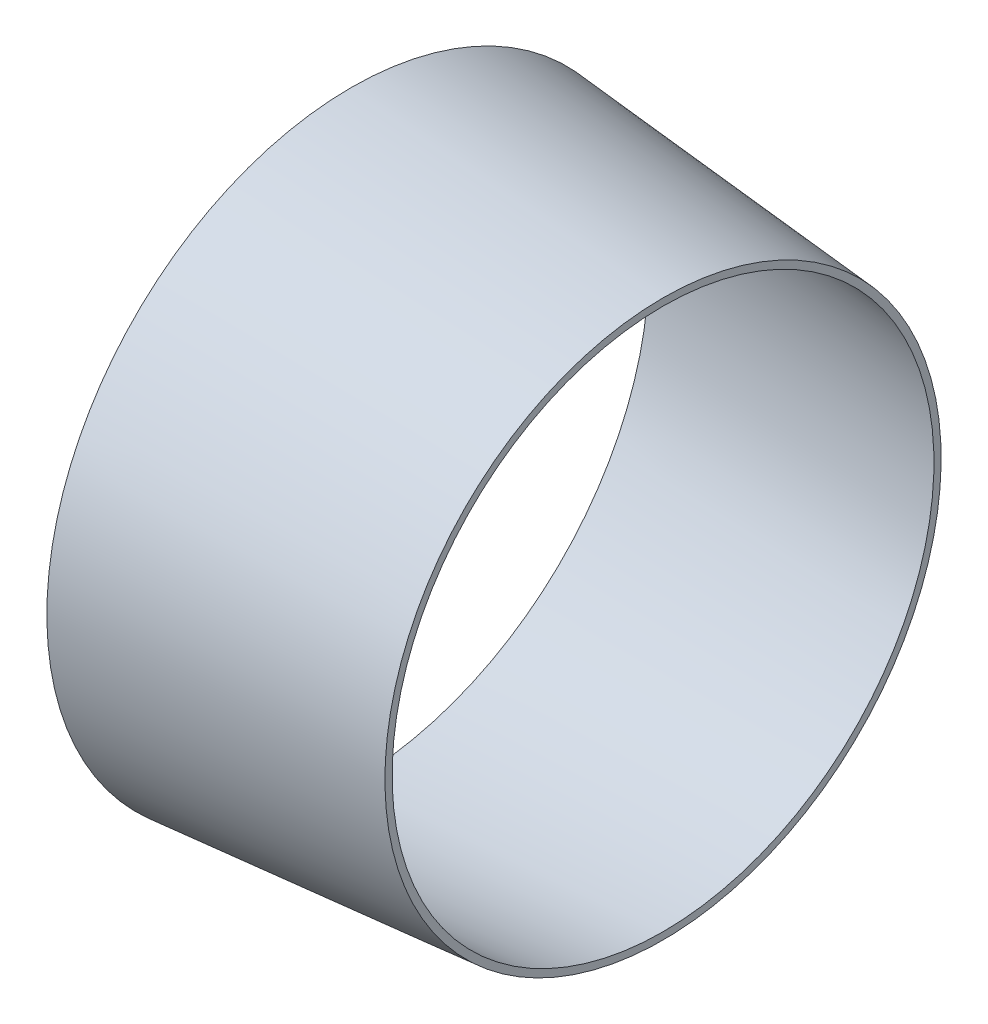
ISO-10303-21;
HEADER;
FILE_DESCRIPTION(('STEP AP214'),'2;1');
FILE_NAME('part.step','',(''),(''),'','','');
FILE_SCHEMA(('AUTOMOTIVE_DESIGN { 1 0 10303 214 1 1 1 1 }'));
ENDSEC;
DATA;
#1=APPLICATION_CONTEXT('core data for automotive mechanical design processes');
#2=APPLICATION_PROTOCOL_DEFINITION('international standard','automotive_design',2000,#1);
#3=PRODUCT_CONTEXT('',#1,'mechanical');
#4=PRODUCT('Part','Part','',(#3));
#5=PRODUCT_RELATED_PRODUCT_CATEGORY('part','',(#4));
#6=PRODUCT_DEFINITION_FORMATION('','',#4);
#7=PRODUCT_DEFINITION_CONTEXT('part definition',#1,'design');
#8=PRODUCT_DEFINITION('design','',#6,#7);
#9=PRODUCT_DEFINITION_SHAPE('','',#8);
#10=(LENGTH_UNIT() NAMED_UNIT(*) SI_UNIT(.MILLI.,.METRE.));
#11=(NAMED_UNIT(*) PLANE_ANGLE_UNIT() SI_UNIT($,.RADIAN.));
#12=(NAMED_UNIT(*) SI_UNIT($,.STERADIAN.) SOLID_ANGLE_UNIT());
#13=UNCERTAINTY_MEASURE_WITH_UNIT(LENGTH_MEASURE(1.E-05),#10,'distance_accuracy_value','');
#14=(GEOMETRIC_REPRESENTATION_CONTEXT(3) GLOBAL_UNCERTAINTY_ASSIGNED_CONTEXT((#13)) GLOBAL_UNIT_ASSIGNED_CONTEXT((#10,
#11,#12)) REPRESENTATION_CONTEXT('',''));
#15=CARTESIAN_POINT('',(0.,0.,0.));
#16=DIRECTION('',(0.,0.,1.));
#17=DIRECTION('',(1.,0.,0.));
#18=AXIS2_PLACEMENT_3D('',#15,#16,#17);
#19=CARTESIAN_POINT('',(3700.,0.,0.));
#20=DIRECTION('',(-1.,0.,0.));
#21=DIRECTION('',(0.,0.,1.));
#22=AXIS2_PLACEMENT_3D('',#19,#20,#21);
#23=CONICAL_SURFACE('',#22,620.,0.0844143056755337);
#24=CARTESIAN_POINT('',(3700.,0.,0.));
#25=DIRECTION('',(-1.,0.,0.));
#26=DIRECTION('',(0.,0.,1.));
#27=AXIS2_PLACEMENT_3D('',#24,#25,#26);
#28=CIRCLE('',#27,620.);
#29=CARTESIAN_POINT('',(3700.,620.,-4.4513433570036E-06));
#30=VERTEX_POINT('',#29);
#31=CARTESIAN_POINT('',(3700.,620.,0.));
#32=VERTEX_POINT('',#31);
#33=EDGE_CURVE('E11',#30,#32,#28,.T.);
#34=ORIENTED_EDGE('',*,*,#33,.T.);
#35=DIRECTION('',(0.996439227690749,-0.0843140884969096,0.));
#36=VECTOR('',#35,1.);
#37=CARTESIAN_POINT('',(4350.,565.,0.));
#38=LINE('',#37,#36);
#39=CARTESIAN_POINT('',(4350.,565.,0.));
#40=VERTEX_POINT('',#39);
#41=EDGE_CURVE('E100',#32,#40,#38,.T.);
#42=ORIENTED_EDGE('',*,*,#41,.T.);
#43=CARTESIAN_POINT('',(4350.,0.,0.));
#44=DIRECTION('',(-1.,0.,0.));
#45=DIRECTION('',(0.,0.,1.));
#46=AXIS2_PLACEMENT_3D('',#43,#44,#45);
#47=CIRCLE('',#46,565.);
#48=CARTESIAN_POINT('',(4350.,565.,-4.05646612372102E-06));
#49=VERTEX_POINT('',#48);
#50=EDGE_CURVE('E80',#49,#40,#47,.T.);
#51=ORIENTED_EDGE('',*,*,#50,.F.);
#52=DIRECTION('',(0.996439227690749,-0.0843140884969096,6.0534025440731E-10));
#53=VECTOR('',#52,1.);
#54=CARTESIAN_POINT('',(4350.,565.,-4.05646612372102E-06));
#55=LINE('',#54,#53);
#56=EDGE_CURVE('E103',#30,#49,#55,.T.);
#57=ORIENTED_EDGE('',*,*,#56,.F.);
#58=EDGE_LOOP('',(#34,#42,#51,#57));
#59=FACE_BOUND('',#58,.T.);
#60=ADVANCED_FACE('F39',(#59),#23,.F.);
#61=CARTESIAN_POINT('',(3700.,620.,-4.4513433570036E-06));
#62=DIRECTION('',(1.,0.,0.));
#63=DIRECTION('',(0.,0.,-1.));
#64=AXIS2_PLACEMENT_3D('',#61,#62,#63);
#65=PLANE('',#64);
#66=CARTESIAN_POINT('',(3700.,0.,0.));
#67=DIRECTION('',(-1.,0.,0.));
#68=DIRECTION('',(0.,0.,1.));
#69=AXIS2_PLACEMENT_3D('',#66,#67,#68);
#70=CIRCLE('',#69,635.);
#71=CARTESIAN_POINT('',(3700.,635.,-4.55903714789885E-06));
#72=VERTEX_POINT('',#71);
#73=CARTESIAN_POINT('',(3700.,635.,0.));
#74=VERTEX_POINT('',#73);
#75=EDGE_CURVE('E50',#72,#74,#70,.T.);
#76=ORIENTED_EDGE('',*,*,#75,.T.);
#77=DIRECTION('',(0.,-1.,0.));
#78=VECTOR('',#77,1.);
#79=CARTESIAN_POINT('',(3700.,620.,0.));
#80=LINE('',#79,#78);
#81=EDGE_CURVE('E104',#74,#32,#80,.T.);
#82=ORIENTED_EDGE('',*,*,#81,.T.);
#83=ORIENTED_EDGE('',*,*,#33,.F.);
#84=DIRECTION('',(0.,-1.,7.17958605968322E-09));
#85=VECTOR('',#84,1.);
#86=CARTESIAN_POINT('',(3700.,620.,-4.4513433570036E-06));
#87=LINE('',#86,#85);
#88=EDGE_CURVE('E91',#72,#30,#87,.T.);
#89=ORIENTED_EDGE('',*,*,#88,.F.);
#90=EDGE_LOOP('',(#76,#82,#83,#89));
#91=FACE_BOUND('',#90,.T.);
#92=ADVANCED_FACE('F41',(#91),#65,.F.);
#93=CARTESIAN_POINT('',(4350.,0.,0.));
#94=DIRECTION('',(-1.,0.,0.));
#95=DIRECTION('',(0.,0.,1.));
#96=AXIS2_PLACEMENT_3D('',#93,#94,#95);
#97=CONICAL_SURFACE('',#96,580.,0.0844143056755337);
#98=CARTESIAN_POINT('',(4350.,0.,0.));
#99=DIRECTION('',(-1.,0.,0.));
#100=DIRECTION('',(0.,0.,1.));
#101=AXIS2_PLACEMENT_3D('',#98,#99,#100);
#102=CIRCLE('',#101,580.);
#103=CARTESIAN_POINT('',(4350.,580.,-4.16415991461627E-06));
#104=VERTEX_POINT('',#103);
#105=CARTESIAN_POINT('',(4350.,580.,0.));
#106=VERTEX_POINT('',#105);
#107=EDGE_CURVE('E89',#104,#106,#102,.T.);
#108=ORIENTED_EDGE('',*,*,#107,.T.);
#109=DIRECTION('',(-0.996439227690749,0.0843140884969096,0.));
#110=VECTOR('',#109,1.);
#111=CARTESIAN_POINT('',(3700.,635.,0.));
#112=LINE('',#111,#110);
#113=EDGE_CURVE('E97',#106,#74,#112,.T.);
#114=ORIENTED_EDGE('',*,*,#113,.T.);
#115=ORIENTED_EDGE('',*,*,#75,.F.);
#116=DIRECTION('',(-0.996439227690749,0.0843140884969096,-6.0534025440731E-10));
#117=VECTOR('',#116,1.);
#118=CARTESIAN_POINT('',(3700.,635.,-4.55903714789885E-06));
#119=LINE('',#118,#117);
#120=EDGE_CURVE('E109',#104,#72,#119,.T.);
#121=ORIENTED_EDGE('',*,*,#120,.F.);
#122=EDGE_LOOP('',(#108,#114,#115,#121));
#123=FACE_BOUND('',#122,.T.);
#124=ADVANCED_FACE('F112',(#123),#97,.T.);
#125=CARTESIAN_POINT('',(4350.,580.,-4.16415991461627E-06));
#126=DIRECTION('',(-1.,0.,0.));
#127=DIRECTION('',(0.,0.,1.));
#128=AXIS2_PLACEMENT_3D('',#125,#126,#127);
#129=PLANE('',#128);
#130=DIRECTION('',(0.,1.,-7.17958605968322E-09));
#131=VECTOR('',#130,1.);
#132=CARTESIAN_POINT('',(4350.,580.,-4.16415991461627E-06));
#133=LINE('',#132,#131);
#134=EDGE_CURVE('E82',#49,#104,#133,.T.);
#135=ORIENTED_EDGE('',*,*,#134,.F.);
#136=ORIENTED_EDGE('',*,*,#50,.T.);
#137=DIRECTION('',(0.,1.,0.));
#138=VECTOR('',#137,1.);
#139=CARTESIAN_POINT('',(4350.,580.,0.));
#140=LINE('',#139,#138);
#141=EDGE_CURVE('E85',#40,#106,#140,.T.);
#142=ORIENTED_EDGE('',*,*,#141,.T.);
#143=ORIENTED_EDGE('',*,*,#107,.F.);
#144=EDGE_LOOP('',(#135,#136,#142,#143));
#145=FACE_BOUND('',#144,.T.);
#146=ADVANCED_FACE('F83',(#145),#129,.F.);
#147=CARTESIAN_POINT('',(0.,0.,0.));
#148=DIRECTION('',(0.,-7.17958605968322E-09,-1.));
#149=DIRECTION('',(-1.,0.,0.));
#150=AXIS2_PLACEMENT_3D('',#147,#148,#149);
#151=PLANE('',#150);
#152=ORIENTED_EDGE('',*,*,#56,.T.);
#153=ORIENTED_EDGE('',*,*,#134,.T.);
#154=ORIENTED_EDGE('',*,*,#120,.T.);
#155=ORIENTED_EDGE('',*,*,#88,.T.);
#156=EDGE_LOOP('',(#152,#153,#154,#155));
#157=FACE_BOUND('',#156,.T.);
#158=ADVANCED_FACE('F111',(#157),#151,.F.);
#159=CARTESIAN_POINT('',(0.,0.,0.));
#160=DIRECTION('',(0.,0.,-1.));
#161=DIRECTION('',(-1.,0.,0.));
#162=AXIS2_PLACEMENT_3D('',#159,#160,#161);
#163=PLANE('',#162);
#164=ORIENTED_EDGE('',*,*,#41,.F.);
#165=ORIENTED_EDGE('',*,*,#81,.F.);
#166=ORIENTED_EDGE('',*,*,#113,.F.);
#167=ORIENTED_EDGE('',*,*,#141,.F.);
#168=EDGE_LOOP('',(#164,#165,#166,#167));
#169=FACE_BOUND('',#168,.T.);
#170=ADVANCED_FACE('F94',(#169),#163,.T.);
#171=CLOSED_SHELL('',(#60,#92,#124,#146,#158,#170));
#172=MANIFOLD_SOLID_BREP('B2',#171);
#173=ADVANCED_BREP_SHAPE_REPRESENTATION('',(#18,#172),#14);
#174=SHAPE_DEFINITION_REPRESENTATION(#9,#173);
ENDSEC;
END-ISO-10303-21;
